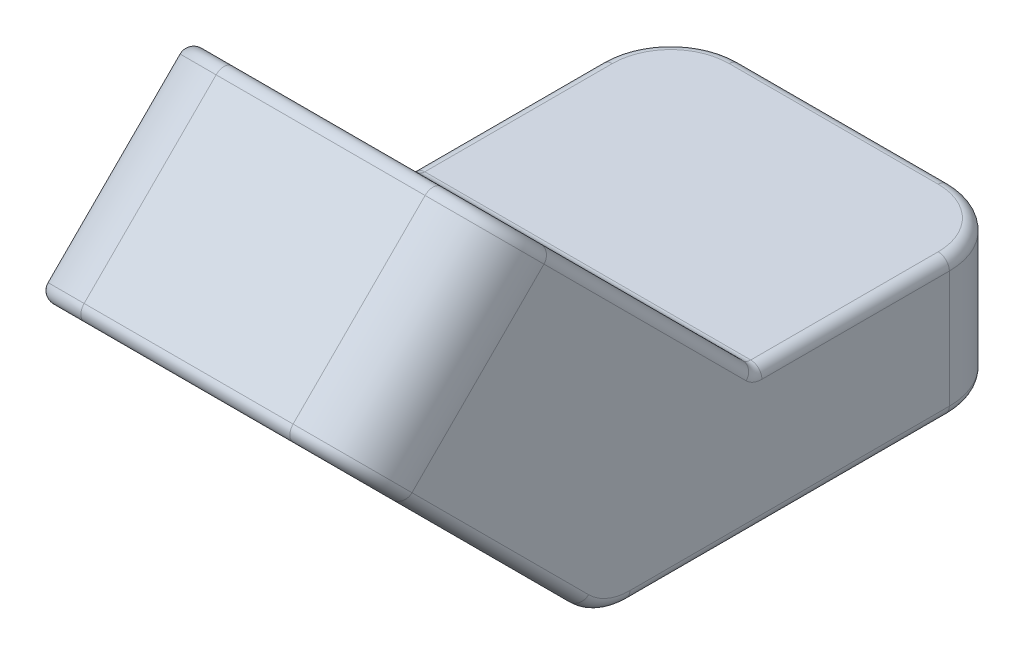
ISO-10303-21;
HEADER;
FILE_DESCRIPTION(('STEP AP214'),'2;1');
FILE_NAME('part.step','',(''),(''),'','','');
FILE_SCHEMA(('AUTOMOTIVE_DESIGN { 1 0 10303 214 1 1 1 1 }'));
ENDSEC;
DATA;
#1=APPLICATION_CONTEXT('core data for automotive mechanical design processes');
#2=APPLICATION_PROTOCOL_DEFINITION('international standard','automotive_design',2000,#1);
#3=PRODUCT_CONTEXT('',#1,'mechanical');
#4=PRODUCT('Part','Part','',(#3));
#5=PRODUCT_RELATED_PRODUCT_CATEGORY('part','',(#4));
#6=PRODUCT_DEFINITION_FORMATION('','',#4);
#7=PRODUCT_DEFINITION_CONTEXT('part definition',#1,'design');
#8=PRODUCT_DEFINITION('design','',#6,#7);
#9=PRODUCT_DEFINITION_SHAPE('','',#8);
#10=(LENGTH_UNIT() NAMED_UNIT(*) SI_UNIT(.MILLI.,.METRE.));
#11=(NAMED_UNIT(*) PLANE_ANGLE_UNIT() SI_UNIT($,.RADIAN.));
#12=(NAMED_UNIT(*) SI_UNIT($,.STERADIAN.) SOLID_ANGLE_UNIT());
#13=UNCERTAINTY_MEASURE_WITH_UNIT(LENGTH_MEASURE(1.E-05),#10,'distance_accuracy_value','');
#14=(GEOMETRIC_REPRESENTATION_CONTEXT(3) GLOBAL_UNCERTAINTY_ASSIGNED_CONTEXT((#13)) GLOBAL_UNIT_ASSIGNED_CONTEXT((#10,
#11,#12)) REPRESENTATION_CONTEXT('',''));
#15=CARTESIAN_POINT('',(0.,0.,0.));
#16=DIRECTION('',(0.,0.,1.));
#17=DIRECTION('',(1.,0.,0.));
#18=AXIS2_PLACEMENT_3D('',#15,#16,#17);
#19=CARTESIAN_POINT('',(15.875,6.35,0.));
#20=DIRECTION('',(0.,0.,1.));
#21=DIRECTION('',(0.,-1.,0.));
#22=AXIS2_PLACEMENT_3D('',#19,#20,#21);
#23=PLANE('',#22);
#24=DIRECTION('',(0.,1.,0.));
#25=VECTOR('',#24,1.);
#26=CARTESIAN_POINT('',(12.7,6.35,0.));
#27=LINE('',#26,#25);
#28=CARTESIAN_POINT('',(12.7,5.842,0.));
#29=VERTEX_POINT('',#28);
#30=CARTESIAN_POINT('',(12.7,0.508,0.));
#31=VERTEX_POINT('',#30);
#32=EDGE_CURVE('E517',#29,#31,#27,.F.);
#33=ORIENTED_EDGE('',*,*,#32,.T.);
#34=DIRECTION('',(-1.,0.,0.));
#35=VECTOR('',#34,1.);
#36=CARTESIAN_POINT('',(15.875,0.508,0.));
#37=LINE('',#36,#35);
#38=CARTESIAN_POINT('',(3.175,0.508,0.));
#39=VERTEX_POINT('',#38);
#40=EDGE_CURVE('E388',#31,#39,#37,.T.);
#41=ORIENTED_EDGE('',*,*,#40,.T.);
#42=DIRECTION('',(0.,1.,0.));
#43=VECTOR('',#42,1.);
#44=CARTESIAN_POINT('',(3.175,6.35,0.));
#45=LINE('',#44,#43);
#46=CARTESIAN_POINT('',(3.175,5.842,0.));
#47=VERTEX_POINT('',#46);
#48=EDGE_CURVE('E513',#39,#47,#45,.T.);
#49=ORIENTED_EDGE('',*,*,#48,.T.);
#50=DIRECTION('',(-1.,0.,0.));
#51=VECTOR('',#50,1.);
#52=CARTESIAN_POINT('',(15.875,5.842,0.));
#53=LINE('',#52,#51);
#54=EDGE_CURVE('E391',#47,#29,#53,.F.);
#55=ORIENTED_EDGE('',*,*,#54,.T.);
#56=EDGE_LOOP('',(#33,#41,#49,#55));
#57=FACE_BOUND('',#56,.T.);
#58=ADVANCED_FACE('F47',(#57),#23,.F.);
#59=CARTESIAN_POINT('',(15.875,6.35,11.9296158183963));
#60=DIRECTION('',(0.,-1.,0.));
#61=DIRECTION('',(0.,0.,-1.));
#62=AXIS2_PLACEMENT_3D('',#59,#60,#61);
#63=PLANE('',#62);
#64=CARTESIAN_POINT('',(3.175,6.35,3.175));
#65=DIRECTION('',(0.,-1.,0.));
#66=DIRECTION('',(0.,0.,-1.));
#67=AXIS2_PLACEMENT_3D('',#64,#65,#66);
#68=CIRCLE('',#67,2.667);
#69=CARTESIAN_POINT('',(3.175,6.35,0.507999999999998));
#70=VERTEX_POINT('',#69);
#71=CARTESIAN_POINT('',(0.508000000000001,6.35,3.175));
#72=VERTEX_POINT('',#71);
#73=EDGE_CURVE('E372',#70,#72,#68,.F.);
#74=ORIENTED_EDGE('',*,*,#73,.T.);
#75=DIRECTION('',(0.,0.,1.));
#76=VECTOR('',#75,1.);
#77=CARTESIAN_POINT('',(0.508,6.35,11.9296158183963));
#78=LINE('',#77,#76);
#79=CARTESIAN_POINT('',(0.508,6.35,11.7191953287107));
#80=VERTEX_POINT('',#79);
#81=EDGE_CURVE('E368',#72,#80,#78,.T.);
#82=ORIENTED_EDGE('',*,*,#81,.T.);
#83=DIRECTION('',(-1.,0.,0.));
#84=VECTOR('',#83,1.);
#85=CARTESIAN_POINT('',(15.875,6.35,11.7191953287107));
#86=LINE('',#85,#84);
#87=CARTESIAN_POINT('',(15.367,6.35,11.7191953287107));
#88=VERTEX_POINT('',#87);
#89=EDGE_CURVE('E381',#80,#88,#86,.F.);
#90=ORIENTED_EDGE('',*,*,#89,.T.);
#91=DIRECTION('',(0.,0.,1.));
#92=VECTOR('',#91,1.);
#93=CARTESIAN_POINT('',(15.367,6.35,11.9296158183963));
#94=LINE('',#93,#92);
#95=CARTESIAN_POINT('',(15.367,6.35,3.175));
#96=VERTEX_POINT('',#95);
#97=EDGE_CURVE('E248',#88,#96,#94,.F.);
#98=ORIENTED_EDGE('',*,*,#97,.T.);
#99=CARTESIAN_POINT('',(12.7,6.35,3.175));
#100=DIRECTION('',(0.,-1.,0.));
#101=DIRECTION('',(0.,0.,-1.));
#102=AXIS2_PLACEMENT_3D('',#99,#100,#101);
#103=CIRCLE('',#102,2.667);
#104=CARTESIAN_POINT('',(12.7,6.35,0.507999999999998));
#105=VERTEX_POINT('',#104);
#106=EDGE_CURVE('E378',#96,#105,#103,.F.);
#107=ORIENTED_EDGE('',*,*,#106,.T.);
#108=DIRECTION('',(-1.,0.,0.));
#109=VECTOR('',#108,1.);
#110=CARTESIAN_POINT('',(15.875,6.35,0.507999999999998));
#111=LINE('',#110,#109);
#112=EDGE_CURVE('E375',#105,#70,#111,.T.);
#113=ORIENTED_EDGE('',*,*,#112,.T.);
#114=EDGE_LOOP('',(#74,#82,#90,#98,#107,#113));
#115=FACE_BOUND('',#114,.T.);
#116=ADVANCED_FACE('F552',(#115),#63,.F.);
#117=CARTESIAN_POINT('',(15.875,17.9605122421383,23.5401280605345));
#118=DIRECTION('',(0.,-0.707106781186546,0.707106781186549));
#119=DIRECTION('',(0.,-0.707106781186549,-0.707106781186546));
#120=AXIS2_PLACEMENT_3D('',#117,#118,#119);
#121=PLANE('',#120);
#122=DIRECTION('',(-1.,0.,0.));
#123=VECTOR('',#122,1.);
#124=CARTESIAN_POINT('',(0.,6.49878975515723,12.0784055735535));
#125=LINE('',#124,#123);
#126=CARTESIAN_POINT('',(15.367,6.49878975515723,12.0784055735535));
#127=VERTEX_POINT('',#126);
#128=CARTESIAN_POINT('',(0.508,6.49878975515723,12.0784055735535));
#129=VERTEX_POINT('',#128);
#130=EDGE_CURVE('E362',#127,#129,#125,.T.);
#131=ORIENTED_EDGE('',*,*,#130,.T.);
#132=DIRECTION('',(0.,0.707106781186549,0.707106781186546));
#133=VECTOR('',#132,1.);
#134=CARTESIAN_POINT('',(0.508,15.715448211871,21.2950640302673));
#135=LINE('',#134,#133);
#136=CARTESIAN_POINT('',(0.508000000000001,15.715448211871,21.2950640302673));
#137=VERTEX_POINT('',#136);
#138=EDGE_CURVE('E11',#129,#137,#135,.T.);
#139=ORIENTED_EDGE('',*,*,#138,.T.);
#140=CARTESIAN_POINT('',(3.175,15.715448211871,21.2950640302673));
#141=DIRECTION('',(0.,-0.707106781186546,0.707106781186549));
#142=DIRECTION('',(0.,-0.707106781186549,-0.707106781186546));
#143=AXIS2_PLACEMENT_3D('',#140,#141,#142);
#144=CIRCLE('',#143,2.667);
#145=CARTESIAN_POINT('',(3.175,17.6013019972955,23.1809178156918));
#146=VERTEX_POINT('',#145);
#147=EDGE_CURVE('E57',#137,#146,#144,.F.);
#148=ORIENTED_EDGE('',*,*,#147,.T.);
#149=DIRECTION('',(-1.,0.,0.));
#150=VECTOR('',#149,1.);
#151=CARTESIAN_POINT('',(15.875,17.6013019972955,23.1809178156918));
#152=LINE('',#151,#150);
#153=CARTESIAN_POINT('',(12.7,17.6013019972955,23.1809178156918));
#154=VERTEX_POINT('',#153);
#155=EDGE_CURVE('E356',#146,#154,#152,.F.);
#156=ORIENTED_EDGE('',*,*,#155,.T.);
#157=CARTESIAN_POINT('',(12.7,15.715448211871,21.2950640302673));
#158=DIRECTION('',(0.,-0.707106781186546,0.707106781186549));
#159=DIRECTION('',(0.,-0.707106781186549,-0.707106781186546));
#160=AXIS2_PLACEMENT_3D('',#157,#158,#159);
#161=CIRCLE('',#160,2.667);
#162=CARTESIAN_POINT('',(15.367,15.715448211871,21.2950640302673));
#163=VERTEX_POINT('',#162);
#164=EDGE_CURVE('E359',#154,#163,#161,.F.);
#165=ORIENTED_EDGE('',*,*,#164,.T.);
#166=DIRECTION('',(0.,0.707106781186549,0.707106781186546));
#167=VECTOR('',#166,1.);
#168=CARTESIAN_POINT('',(15.367,17.9605122421383,23.5401280605345));
#169=LINE('',#168,#167);
#170=EDGE_CURVE('E365',#163,#127,#169,.F.);
#171=ORIENTED_EDGE('',*,*,#170,.T.);
#172=EDGE_LOOP('',(#131,#139,#148,#156,#165,#171));
#173=FACE_BOUND('',#172,.T.);
#174=CARTESIAN_POINT('',(7.9375,11.5585485502201,17.1381643686164));
#175=DIRECTION('',(0.,-0.707106781186546,0.707106781186549));
#176=DIRECTION('',(0.,-0.707106781186549,-0.707106781186546));
#177=AXIS2_PLACEMENT_3D('',#174,#175,#176);
#178=CIRCLE('',#177,6.47699999999998);
#179=CARTESIAN_POINT('',(7.9375,6.97861792847485,12.5582337468711));
#180=VERTEX_POINT('',#179);
#181=EDGE_CURVE('E520',#180,#180,#178,.T.);
#182=ORIENTED_EDGE('',*,*,#181,.T.);
#183=EDGE_LOOP('',(#182));
#184=FACE_BOUND('',#183,.T.);
#185=ADVANCED_FACE('F558',(#173,#184),#121,.F.);
#186=CARTESIAN_POINT('',(15.875,11.2253201513365,30.2753201513364));
#187=DIRECTION('',(0.,-0.707106781186549,-0.707106781186546));
#188=DIRECTION('',(0.,0.707106781186546,-0.707106781186549));
#189=AXIS2_PLACEMENT_3D('',#186,#187,#188);
#190=PLANE('',#189);
#191=DIRECTION('',(0.,-0.707106781186546,0.707106781186549));
#192=VECTOR('',#191,1.);
#193=CARTESIAN_POINT('',(3.175,11.2253201513365,30.2753201513364));
#194=LINE('',#193,#192);
#195=CARTESIAN_POINT('',(3.175,17.6013019972955,23.8993383053773));
#196=VERTEX_POINT('',#195);
#197=CARTESIAN_POINT('',(3.175,11.5845303961792,29.9161099064937));
#198=VERTEX_POINT('',#197);
#199=EDGE_CURVE('E492',#196,#198,#194,.T.);
#200=ORIENTED_EDGE('',*,*,#199,.T.);
#201=DIRECTION('',(-1.,0.,0.));
#202=VECTOR('',#201,1.);
#203=CARTESIAN_POINT('',(15.875,11.5845303961792,29.9161099064937));
#204=LINE('',#203,#202);
#205=CARTESIAN_POINT('',(12.7,11.5845303961792,29.9161099064937));
#206=VERTEX_POINT('',#205);
#207=EDGE_CURVE('E440',#198,#206,#204,.F.);
#208=ORIENTED_EDGE('',*,*,#207,.T.);
#209=DIRECTION('',(0.,-0.707106781186546,0.707106781186549));
#210=VECTOR('',#209,1.);
#211=CARTESIAN_POINT('',(12.7,11.2253201513365,30.2753201513364));
#212=LINE('',#211,#210);
#213=CARTESIAN_POINT('',(12.7,17.6013019972955,23.8993383053773));
#214=VERTEX_POINT('',#213);
#215=EDGE_CURVE('E235',#206,#214,#212,.F.);
#216=ORIENTED_EDGE('',*,*,#215,.T.);
#217=DIRECTION('',(-1.,0.,0.));
#218=VECTOR('',#217,1.);
#219=CARTESIAN_POINT('',(15.875,17.6013019972955,23.8993383053773));
#220=LINE('',#219,#218);
#221=EDGE_CURVE('E443',#214,#196,#220,.T.);
#222=ORIENTED_EDGE('',*,*,#221,.T.);
#223=EDGE_LOOP('',(#200,#208,#216,#222));
#224=FACE_BOUND('',#223,.T.);
#225=ADVANCED_FACE('F724',(#224),#190,.F.);
#226=CARTESIAN_POINT('',(15.875,0.,19.05));
#227=DIRECTION('',(0.,0.707106781186546,-0.707106781186549));
#228=DIRECTION('',(0.,0.707106781186549,0.707106781186546));
#229=AXIS2_PLACEMENT_3D('',#226,#227,#228);
#230=PLANE('',#229);
#231=CARTESIAN_POINT('',(7.9375,4.82335645941826,23.8733564594183));
#232=DIRECTION('',(0.,0.707106781186546,-0.707106781186549));
#233=DIRECTION('',(0.,0.707106781186549,0.707106781186546));
#234=AXIS2_PLACEMENT_3D('',#231,#232,#233);
#235=CIRCLE('',#234,3.302);
#236=CARTESIAN_POINT('',(7.9375,7.15822305089625,26.2082230508962));
#237=VERTEX_POINT('',#236);
#238=EDGE_CURVE('E294',#237,#237,#235,.T.);
#239=ORIENTED_EDGE('',*,*,#238,.T.);
#240=EDGE_LOOP('',(#239));
#241=FACE_BOUND('',#240,.T.);
#242=DIRECTION('',(-1.,0.,0.));
#243=VECTOR('',#242,1.);
#244=CARTESIAN_POINT('',(15.875,0.929935969732714,19.9799359697327));
#245=LINE('',#244,#243);
#246=CARTESIAN_POINT('',(0.508,0.929935969732714,19.9799359697327));
#247=VERTEX_POINT('',#246);
#248=CARTESIAN_POINT('',(15.367,0.929935969732714,19.9799359697327));
#249=VERTEX_POINT('',#248);
#250=EDGE_CURVE('E488',#247,#249,#245,.F.);
#251=ORIENTED_EDGE('',*,*,#250,.T.);
#252=DIRECTION('',(0.,-0.707106781186549,-0.707106781186546));
#253=VECTOR('',#252,1.);
#254=CARTESIAN_POINT('',(15.367,0.,19.05));
#255=LINE('',#254,#253);
#256=CARTESIAN_POINT('',(15.367,8.98025612106917,28.0302561210691));
#257=VERTEX_POINT('',#256);
#258=EDGE_CURVE('E452',#249,#257,#255,.F.);
#259=ORIENTED_EDGE('',*,*,#258,.T.);
#260=CARTESIAN_POINT('',(12.7,8.98025612106917,28.0302561210691));
#261=DIRECTION('',(0.,0.707106781186546,-0.707106781186549));
#262=DIRECTION('',(0.,0.707106781186549,0.707106781186546));
#263=AXIS2_PLACEMENT_3D('',#260,#261,#262);
#264=CIRCLE('',#263,2.667);
#265=CARTESIAN_POINT('',(12.7,10.8661099064937,29.9161099064937));
#266=VERTEX_POINT('',#265);
#267=EDGE_CURVE('E455',#257,#266,#264,.F.);
#268=ORIENTED_EDGE('',*,*,#267,.T.);
#269=DIRECTION('',(-1.,0.,0.));
#270=VECTOR('',#269,1.);
#271=CARTESIAN_POINT('',(15.875,10.8661099064937,29.9161099064937));
#272=LINE('',#271,#270);
#273=CARTESIAN_POINT('',(3.175,10.8661099064937,29.9161099064937));
#274=VERTEX_POINT('',#273);
#275=EDGE_CURVE('E458',#266,#274,#272,.T.);
#276=ORIENTED_EDGE('',*,*,#275,.T.);
#277=CARTESIAN_POINT('',(3.175,8.98025612106917,28.0302561210691));
#278=DIRECTION('',(0.,0.707106781186546,-0.707106781186549));
#279=DIRECTION('',(0.,0.707106781186549,0.707106781186546));
#280=AXIS2_PLACEMENT_3D('',#277,#278,#279);
#281=CIRCLE('',#280,2.667);
#282=CARTESIAN_POINT('',(0.508,8.98025612106917,28.0302561210691));
#283=VERTEX_POINT('',#282);
#284=EDGE_CURVE('E461',#274,#283,#281,.F.);
#285=ORIENTED_EDGE('',*,*,#284,.T.);
#286=DIRECTION('',(0.,-0.707106781186549,-0.707106781186546));
#287=VECTOR('',#286,1.);
#288=CARTESIAN_POINT('',(0.508,0.929935969732715,19.9799359697327));
#289=LINE('',#288,#287);
#290=EDGE_CURVE('E464',#283,#247,#289,.T.);
#291=ORIENTED_EDGE('',*,*,#290,.T.);
#292=EDGE_LOOP('',(#251,#259,#268,#276,#285,#291));
#293=FACE_BOUND('',#292,.T.);
#294=ADVANCED_FACE('F532',(#241,#293),#230,.F.);
#295=CARTESIAN_POINT('',(15.875,0.,0.));
#296=DIRECTION('',(0.,1.,0.));
#297=DIRECTION('',(0.,0.,1.));
#298=AXIS2_PLACEMENT_3D('',#295,#296,#297);
#299=PLANE('',#298);
#300=DIRECTION('',(-1.,0.,0.));
#301=VECTOR('',#300,1.);
#302=CARTESIAN_POINT('',(15.875,0.,17.7348719394654));
#303=LINE('',#302,#301);
#304=CARTESIAN_POINT('',(15.367,0.,17.7348719394654));
#305=VERTEX_POINT('',#304);
#306=CARTESIAN_POINT('',(0.508,0.,17.7348719394654));
#307=VERTEX_POINT('',#306);
#308=EDGE_CURVE('E501',#305,#307,#303,.T.);
#309=ORIENTED_EDGE('',*,*,#308,.T.);
#310=DIRECTION('',(0.,0.,-1.));
#311=VECTOR('',#310,1.);
#312=CARTESIAN_POINT('',(0.508,0.,3.175));
#313=LINE('',#312,#311);
#314=CARTESIAN_POINT('',(0.508000000000001,0.,3.175));
#315=VERTEX_POINT('',#314);
#316=EDGE_CURVE('E400',#307,#315,#313,.T.);
#317=ORIENTED_EDGE('',*,*,#316,.T.);
#318=CARTESIAN_POINT('',(3.175,0.,3.175));
#319=DIRECTION('',(0.,1.,0.));
#320=DIRECTION('',(0.,0.,1.));
#321=AXIS2_PLACEMENT_3D('',#318,#319,#320);
#322=CIRCLE('',#321,2.667);
#323=CARTESIAN_POINT('',(3.175,0.,0.508));
#324=VERTEX_POINT('',#323);
#325=EDGE_CURVE('E403',#315,#324,#322,.F.);
#326=ORIENTED_EDGE('',*,*,#325,.T.);
#327=DIRECTION('',(-1.,0.,0.));
#328=VECTOR('',#327,1.);
#329=CARTESIAN_POINT('',(15.875,0.,0.508));
#330=LINE('',#329,#328);
#331=CARTESIAN_POINT('',(12.7,0.,0.508));
#332=VERTEX_POINT('',#331);
#333=EDGE_CURVE('E406',#324,#332,#330,.F.);
#334=ORIENTED_EDGE('',*,*,#333,.T.);
#335=CARTESIAN_POINT('',(12.7,0.,3.175));
#336=DIRECTION('',(0.,1.,0.));
#337=DIRECTION('',(0.,0.,1.));
#338=AXIS2_PLACEMENT_3D('',#335,#336,#337);
#339=CIRCLE('',#338,2.667);
#340=CARTESIAN_POINT('',(15.367,0.,3.175));
#341=VERTEX_POINT('',#340);
#342=EDGE_CURVE('E409',#332,#341,#339,.F.);
#343=ORIENTED_EDGE('',*,*,#342,.T.);
#344=DIRECTION('',(0.,0.,-1.));
#345=VECTOR('',#344,1.);
#346=CARTESIAN_POINT('',(15.367,0.,0.));
#347=LINE('',#346,#345);
#348=EDGE_CURVE('E251',#341,#305,#347,.F.);
#349=ORIENTED_EDGE('',*,*,#348,.T.);
#350=EDGE_LOOP('',(#309,#317,#326,#334,#343,#349));
#351=FACE_BOUND('',#350,.T.);
#352=ADVANCED_FACE('F736',(#351),#299,.F.);
#353=CARTESIAN_POINT('',(15.875,0.,0.));
#354=DIRECTION('',(-1.,0.,0.));
#355=DIRECTION('',(0.,0.,1.));
#356=AXIS2_PLACEMENT_3D('',#353,#354,#355);
#357=PLANE('',#356);
#358=DIRECTION('',(0.,-0.707106781186546,0.707106781186549));
#359=VECTOR('',#358,1.);
#360=CARTESIAN_POINT('',(15.875,18.5052561210692,18.5052561210691));
#361=LINE('',#360,#359);
#362=CARTESIAN_POINT('',(15.875,15.3562379670283,21.65427427511));
#363=VERTEX_POINT('',#362);
#364=CARTESIAN_POINT('',(15.875,9.33946636591193,27.6710458762264));
#365=VERTEX_POINT('',#364);
#366=EDGE_CURVE('E236',#363,#365,#361,.T.);
#367=ORIENTED_EDGE('',*,*,#366,.T.);
#368=DIRECTION('',(0.,-0.707106781186549,-0.707106781186546));
#369=VECTOR('',#368,1.);
#370=CARTESIAN_POINT('',(15.875,-9.16578975515724,9.16578975515727));
#371=LINE('',#370,#369);
#372=CARTESIAN_POINT('',(15.875,1.28914621457548,19.6207257248899));
#373=VERTEX_POINT('',#372);
#374=EDGE_CURVE('E474',#365,#373,#371,.T.);
#375=ORIENTED_EDGE('',*,*,#374,.T.);
#376=CARTESIAN_POINT('',(15.875,3.175,17.7348719394654));
#377=DIRECTION('',(-1.,0.,0.));
#378=DIRECTION('',(0.,0.,1.));
#379=AXIS2_PLACEMENT_3D('',#376,#377,#378);
#380=CIRCLE('',#379,2.667);
#381=CARTESIAN_POINT('',(15.875,0.507999999999998,17.7348719394654));
#382=VERTEX_POINT('',#381);
#383=EDGE_CURVE('E219',#373,#382,#380,.F.);
#384=ORIENTED_EDGE('',*,*,#383,.T.);
#385=DIRECTION('',(0.,0.,-1.));
#386=VECTOR('',#385,1.);
#387=CARTESIAN_POINT('',(15.875,0.508,0.));
#388=LINE('',#387,#386);
#389=CARTESIAN_POINT('',(15.875,0.508,3.175));
#390=VERTEX_POINT('',#389);
#391=EDGE_CURVE('E212',#382,#390,#388,.T.);
#392=ORIENTED_EDGE('',*,*,#391,.T.);
#393=DIRECTION('',(0.,1.,0.));
#394=VECTOR('',#393,1.);
#395=CARTESIAN_POINT('',(15.875,0.,3.175));
#396=LINE('',#395,#394);
#397=CARTESIAN_POINT('',(15.875,5.842,3.175));
#398=VERTEX_POINT('',#397);
#399=EDGE_CURVE('E216',#390,#398,#396,.T.);
#400=ORIENTED_EDGE('',*,*,#399,.T.);
#401=DIRECTION('',(0.,0.,1.));
#402=VECTOR('',#401,1.);
#403=CARTESIAN_POINT('',(15.875,5.842,0.));
#404=LINE('',#403,#402);
#405=CARTESIAN_POINT('',(15.875,5.842,11.7191953287107));
#406=VERTEX_POINT('',#405);
#407=EDGE_CURVE('E224',#398,#406,#404,.T.);
#408=ORIENTED_EDGE('',*,*,#407,.T.);
#409=CARTESIAN_POINT('',(15.875,6.858,11.7191953287107));
#410=DIRECTION('',(-1.,0.,0.));
#411=DIRECTION('',(0.,0.,1.));
#412=AXIS2_PLACEMENT_3D('',#409,#410,#411);
#413=CIRCLE('',#412,1.016);
#414=CARTESIAN_POINT('',(15.875,6.13957951031447,12.4376158183963));
#415=VERTEX_POINT('',#414);
#416=EDGE_CURVE('E481',#415,#406,#413,.F.);
#417=ORIENTED_EDGE('',*,*,#416,.F.);
#418=DIRECTION('',(0.,0.707106781186549,0.707106781186546));
#419=VECTOR('',#418,1.);
#420=CARTESIAN_POINT('',(15.875,-3.14901815404091,3.14901815404092));
#421=LINE('',#420,#419);
#422=EDGE_CURVE('E485',#415,#363,#421,.T.);
#423=ORIENTED_EDGE('',*,*,#422,.T.);
#424=EDGE_LOOP('',(#367,#375,#384,#392,#400,#408,#417,#423));
#425=FACE_BOUND('',#424,.T.);
#426=ADVANCED_FACE('F215',(#425),#357,.F.);
#427=CARTESIAN_POINT('',(0.,0.,0.));
#428=DIRECTION('',(-1.,0.,0.));
#429=DIRECTION('',(0.,0.,1.));
#430=AXIS2_PLACEMENT_3D('',#427,#428,#429);
#431=PLANE('',#430);
#432=CARTESIAN_POINT('',(0.,3.175,17.7348719394654));
#433=DIRECTION('',(-1.,0.,0.));
#434=DIRECTION('',(0.,0.,1.));
#435=AXIS2_PLACEMENT_3D('',#432,#433,#434);
#436=CIRCLE('',#435,2.667);
#437=CARTESIAN_POINT('',(0.,0.507999999999998,17.7348719394654));
#438=VERTEX_POINT('',#437);
#439=CARTESIAN_POINT('',(0.,1.28914621457548,19.6207257248899));
#440=VERTEX_POINT('',#439);
#441=EDGE_CURVE('E417',#438,#440,#436,.T.);
#442=ORIENTED_EDGE('',*,*,#441,.T.);
#443=DIRECTION('',(0.,-0.707106781186549,-0.707106781186546));
#444=VECTOR('',#443,1.);
#445=CARTESIAN_POINT('',(0.,9.33946636591193,27.6710458762264));
#446=LINE('',#445,#444);
#447=CARTESIAN_POINT('',(0.,9.33946636591193,27.6710458762264));
#448=VERTEX_POINT('',#447);
#449=EDGE_CURVE('E414',#440,#448,#446,.F.);
#450=ORIENTED_EDGE('',*,*,#449,.T.);
#451=DIRECTION('',(0.,-0.707106781186546,0.707106781186549));
#452=VECTOR('',#451,1.);
#453=CARTESIAN_POINT('',(0.,15.715448211871,21.2950640302673));
#454=LINE('',#453,#452);
#455=CARTESIAN_POINT('',(0.,15.3562379670283,21.65427427511));
#456=VERTEX_POINT('',#455);
#457=EDGE_CURVE('E509',#448,#456,#454,.F.);
#458=ORIENTED_EDGE('',*,*,#457,.T.);
#459=DIRECTION('',(0.,0.707106781186549,0.707106781186546));
#460=VECTOR('',#459,1.);
#461=CARTESIAN_POINT('',(0.,5.99078975515723,12.288826063239));
#462=LINE('',#461,#460);
#463=CARTESIAN_POINT('',(0.,6.13957951031447,12.4376158183963));
#464=VERTEX_POINT('',#463);
#465=EDGE_CURVE('E427',#456,#464,#462,.F.);
#466=ORIENTED_EDGE('',*,*,#465,.T.);
#467=CARTESIAN_POINT('',(0.,6.858,11.7191953287107));
#468=DIRECTION('',(-1.,0.,0.));
#469=DIRECTION('',(0.,0.,1.));
#470=AXIS2_PLACEMENT_3D('',#467,#468,#469);
#471=CIRCLE('',#470,1.016);
#472=CARTESIAN_POINT('',(0.,5.842,11.7191953287107));
#473=VERTEX_POINT('',#472);
#474=EDGE_CURVE('E430',#473,#464,#471,.T.);
#475=ORIENTED_EDGE('',*,*,#474,.F.);
#476=DIRECTION('',(0.,0.,1.));
#477=VECTOR('',#476,1.);
#478=CARTESIAN_POINT('',(0.,5.842,3.175));
#479=LINE('',#478,#477);
#480=CARTESIAN_POINT('',(0.,5.842,3.175));
#481=VERTEX_POINT('',#480);
#482=EDGE_CURVE('E423',#473,#481,#479,.F.);
#483=ORIENTED_EDGE('',*,*,#482,.T.);
#484=DIRECTION('',(0.,1.,0.));
#485=VECTOR('',#484,1.);
#486=CARTESIAN_POINT('',(0.,0.,3.175));
#487=LINE('',#486,#485);
#488=CARTESIAN_POINT('',(0.,0.508,3.175));
#489=VERTEX_POINT('',#488);
#490=EDGE_CURVE('E505',#481,#489,#487,.F.);
#491=ORIENTED_EDGE('',*,*,#490,.T.);
#492=DIRECTION('',(0.,0.,-1.));
#493=VECTOR('',#492,1.);
#494=CARTESIAN_POINT('',(0.,0.507999999999998,17.7348719394654));
#495=LINE('',#494,#493);
#496=EDGE_CURVE('E420',#489,#438,#495,.F.);
#497=ORIENTED_EDGE('',*,*,#496,.T.);
#498=EDGE_LOOP('',(#442,#450,#458,#466,#475,#483,#491,#497));
#499=FACE_BOUND('',#498,.T.);
#500=ADVANCED_FACE('F538',(#499),#431,.T.);
#501=CARTESIAN_POINT('',(7.9375,-0.789303616249948,29.4860165350865));
#502=DIRECTION('',(0.,0.707106781186547,-0.707106781186549));
#503=DIRECTION('',(0.,0.707106781186549,0.707106781186546));
#504=AXIS2_PLACEMENT_3D('',#501,#502,#503);
#505=CYLINDRICAL_SURFACE('',#504,3.302);
#506=CARTESIAN_POINT('',(7.9375,8.97589781761239,19.7208151012241));
#507=DIRECTION('',(0.,-0.707106781186546,0.707106781186549));
#508=DIRECTION('',(0.,-0.707106781186549,-0.707106781186546));
#509=AXIS2_PLACEMENT_3D('',#506,#507,#508);
#510=CIRCLE('',#509,3.302);
#511=CARTESIAN_POINT('',(7.9375,6.6410312261344,17.3859485097461));
#512=VERTEX_POINT('',#511);
#513=EDGE_CURVE('E524',#512,#512,#510,.F.);
#514=ORIENTED_EDGE('',*,*,#513,.T.);
#515=EDGE_LOOP('',(#514));
#516=FACE_BOUND('',#515,.T.);
#517=ORIENTED_EDGE('',*,*,#238,.F.);
#518=EDGE_LOOP('',(#517));
#519=FACE_BOUND('',#518,.T.);
#520=ADVANCED_FACE('F535',(#516,#519),#505,.F.);
#521=CARTESIAN_POINT('',(7.9375,8.97589781761239,19.7208151012241));
#522=DIRECTION('',(0.,0.707106781186546,-0.707106781186549));
#523=DIRECTION('',(0.,0.707106781186549,0.707106781186546));
#524=AXIS2_PLACEMENT_3D('',#521,#522,#523);
#525=CONICAL_SURFACE('',#524,3.302,0.715584993317676);
#526=ORIENTED_EDGE('',*,*,#181,.F.);
#527=EDGE_LOOP('',(#526));
#528=FACE_BOUND('',#527,.T.);
#529=ORIENTED_EDGE('',*,*,#513,.F.);
#530=EDGE_LOOP('',(#529));
#531=FACE_BOUND('',#530,.T.);
#532=ADVANCED_FACE('F537',(#528,#531),#525,.F.);
#533=CARTESIAN_POINT('',(3.175,6.35,3.175));
#534=DIRECTION('',(0.,-1.,0.));
#535=DIRECTION('',(0.,0.,-1.));
#536=AXIS2_PLACEMENT_3D('',#533,#534,#535);
#537=CYLINDRICAL_SURFACE('',#536,3.175);
#538=ORIENTED_EDGE('',*,*,#48,.F.);
#539=CARTESIAN_POINT('',(3.175,0.508,3.175));
#540=DIRECTION('',(0.,1.,0.));
#541=DIRECTION('',(0.,0.,1.));
#542=AXIS2_PLACEMENT_3D('',#539,#540,#541);
#543=CIRCLE('',#542,3.175);
#544=EDGE_CURVE('E394',#39,#489,#543,.T.);
#545=ORIENTED_EDGE('',*,*,#544,.T.);
#546=ORIENTED_EDGE('',*,*,#490,.F.);
#547=CARTESIAN_POINT('',(3.175,5.842,3.175));
#548=DIRECTION('',(0.,-1.,0.));
#549=DIRECTION('',(0.,0.,-1.));
#550=AXIS2_PLACEMENT_3D('',#547,#548,#549);
#551=CIRCLE('',#550,3.175);
#552=EDGE_CURVE('E397',#481,#47,#551,.T.);
#553=ORIENTED_EDGE('',*,*,#552,.T.);
#554=EDGE_LOOP('',(#538,#545,#546,#553));
#555=FACE_BOUND('',#554,.T.);
#556=ADVANCED_FACE('F545',(#555),#537,.T.);
#557=CARTESIAN_POINT('',(12.7,0.,3.175));
#558=DIRECTION('',(0.,1.,0.));
#559=DIRECTION('',(0.,0.,1.));
#560=AXIS2_PLACEMENT_3D('',#557,#558,#559);
#561=CYLINDRICAL_SURFACE('',#560,3.175);
#562=ORIENTED_EDGE('',*,*,#399,.F.);
#563=CARTESIAN_POINT('',(12.7,0.507999999999999,3.175));
#564=DIRECTION('',(0.,1.,0.));
#565=DIRECTION('',(0.,0.,1.));
#566=AXIS2_PLACEMENT_3D('',#563,#564,#565);
#567=CIRCLE('',#566,3.175);
#568=EDGE_CURVE('E230',#390,#31,#567,.T.);
#569=ORIENTED_EDGE('',*,*,#568,.T.);
#570=ORIENTED_EDGE('',*,*,#32,.F.);
#571=CARTESIAN_POINT('',(12.7,5.842,3.175));
#572=DIRECTION('',(0.,-1.,0.));
#573=DIRECTION('',(0.,0.,-1.));
#574=AXIS2_PLACEMENT_3D('',#571,#572,#573);
#575=CIRCLE('',#574,3.175);
#576=EDGE_CURVE('E233',#29,#398,#575,.T.);
#577=ORIENTED_EDGE('',*,*,#576,.T.);
#578=EDGE_LOOP('',(#562,#569,#570,#577));
#579=FACE_BOUND('',#578,.T.);
#580=ADVANCED_FACE('F228',(#579),#561,.T.);
#581=CARTESIAN_POINT('',(3.175,8.98025612106916,28.0302561210691));
#582=DIRECTION('',(0.,0.707106781186546,-0.707106781186549));
#583=DIRECTION('',(0.,0.707106781186549,0.707106781186546));
#584=AXIS2_PLACEMENT_3D('',#581,#582,#583);
#585=CYLINDRICAL_SURFACE('',#584,3.175);
#586=ORIENTED_EDGE('',*,*,#457,.F.);
#587=CARTESIAN_POINT('',(3.175,9.33946636591193,27.6710458762264));
#588=DIRECTION('',(0.,0.707106781186546,-0.707106781186549));
#589=DIRECTION('',(0.,0.707106781186549,0.707106781186546));
#590=AXIS2_PLACEMENT_3D('',#587,#588,#589);
#591=CIRCLE('',#590,3.175);
#592=EDGE_CURVE('E434',#448,#198,#591,.T.);
#593=ORIENTED_EDGE('',*,*,#592,.T.);
#594=ORIENTED_EDGE('',*,*,#199,.F.);
#595=CARTESIAN_POINT('',(3.175,15.3562379670283,21.65427427511));
#596=DIRECTION('',(0.,-0.707106781186546,0.707106781186549));
#597=DIRECTION('',(0.,-0.707106781186549,-0.707106781186546));
#598=AXIS2_PLACEMENT_3D('',#595,#596,#597);
#599=CIRCLE('',#598,3.175);
#600=EDGE_CURVE('E437',#196,#456,#599,.T.);
#601=ORIENTED_EDGE('',*,*,#600,.T.);
#602=EDGE_LOOP('',(#586,#593,#594,#601));
#603=FACE_BOUND('',#602,.T.);
#604=ADVANCED_FACE('F571',(#603),#585,.T.);
#605=CARTESIAN_POINT('',(12.7,18.5052561210692,18.5052561210691));
#606=DIRECTION('',(0.,-0.707106781186546,0.707106781186549));
#607=DIRECTION('',(0.,-0.707106781186549,-0.707106781186546));
#608=AXIS2_PLACEMENT_3D('',#605,#606,#607);
#609=CYLINDRICAL_SURFACE('',#608,3.175);
#610=ORIENTED_EDGE('',*,*,#215,.F.);
#611=CARTESIAN_POINT('',(12.7,9.33946636591193,27.6710458762264));
#612=DIRECTION('',(0.,0.707106781186546,-0.707106781186549));
#613=DIRECTION('',(0.,0.707106781186549,0.707106781186546));
#614=AXIS2_PLACEMENT_3D('',#611,#612,#613);
#615=CIRCLE('',#614,3.175);
#616=EDGE_CURVE('E446',#206,#365,#615,.T.);
#617=ORIENTED_EDGE('',*,*,#616,.T.);
#618=ORIENTED_EDGE('',*,*,#366,.F.);
#619=CARTESIAN_POINT('',(12.7,15.3562379670283,21.65427427511));
#620=DIRECTION('',(0.,-0.707106781186546,0.707106781186549));
#621=DIRECTION('',(0.,-0.707106781186549,-0.707106781186546));
#622=AXIS2_PLACEMENT_3D('',#619,#620,#621);
#623=CIRCLE('',#622,3.175);
#624=EDGE_CURVE('E449',#363,#214,#623,.T.);
#625=ORIENTED_EDGE('',*,*,#624,.T.);
#626=EDGE_LOOP('',(#610,#617,#618,#625));
#627=FACE_BOUND('',#626,.T.);
#628=ADVANCED_FACE('F574',(#627),#609,.T.);
#629=CARTESIAN_POINT('',(15.875,3.175,17.7348719394654));
#630=DIRECTION('',(-1.,0.,0.));
#631=DIRECTION('',(0.,0.,1.));
#632=AXIS2_PLACEMENT_3D('',#629,#630,#631);
#633=CYLINDRICAL_SURFACE('',#632,3.175);
#634=ORIENTED_EDGE('',*,*,#308,.F.);
#635=CARTESIAN_POINT('',(15.367,3.175,17.7348719394654));
#636=DIRECTION('',(-1.,0.,0.));
#637=DIRECTION('',(0.,0.,1.));
#638=AXIS2_PLACEMENT_3D('',#635,#636,#637);
#639=CIRCLE('',#638,3.175);
#640=EDGE_CURVE('E467',#305,#249,#639,.T.);
#641=ORIENTED_EDGE('',*,*,#640,.T.);
#642=ORIENTED_EDGE('',*,*,#250,.F.);
#643=CARTESIAN_POINT('',(0.508,3.175,17.7348719394654));
#644=DIRECTION('',(-1.,0.,0.));
#645=DIRECTION('',(0.,0.,1.));
#646=AXIS2_PLACEMENT_3D('',#643,#644,#645);
#647=CIRCLE('',#646,3.175);
#648=EDGE_CURVE('E471',#247,#307,#647,.F.);
#649=ORIENTED_EDGE('',*,*,#648,.T.);
#650=EDGE_LOOP('',(#634,#641,#642,#649));
#651=FACE_BOUND('',#650,.T.);
#652=ADVANCED_FACE('F578',(#651),#633,.T.);
#653=CARTESIAN_POINT('',(0.508,3.175,17.7348719394654));
#654=DIRECTION('',(-1.,0.,0.));
#655=DIRECTION('',(0.,0.,1.));
#656=AXIS2_PLACEMENT_3D('',#653,#654,#655);
#657=TOROIDAL_SURFACE('',#656,2.667,0.508);
#658=CARTESIAN_POINT('',(0.508,0.507999999999998,17.7348719394654));
#659=DIRECTION('',(0.,0.,-1.));
#660=DIRECTION('',(-1.,0.,0.));
#661=AXIS2_PLACEMENT_3D('',#658,#659,#660);
#662=CIRCLE('',#661,0.508);
#663=EDGE_CURVE('E286',#307,#438,#662,.T.);
#664=ORIENTED_EDGE('',*,*,#663,.F.);
#665=ORIENTED_EDGE('',*,*,#648,.F.);
#666=CARTESIAN_POINT('',(0.508,1.28914621457548,19.6207257248899));
#667=DIRECTION('',(0.,0.707106781186548,0.707106781186547));
#668=DIRECTION('',(0.,-0.707106781186547,0.707106781186548));
#669=AXIS2_PLACEMENT_3D('',#666,#667,#668);
#670=CIRCLE('',#669,0.508);
#671=EDGE_CURVE('E290',#440,#247,#670,.T.);
#672=ORIENTED_EDGE('',*,*,#671,.F.);
#673=ORIENTED_EDGE('',*,*,#441,.F.);
#674=EDGE_LOOP('',(#664,#665,#672,#673));
#675=FACE_BOUND('',#674,.T.);
#676=ADVANCED_FACE('F582',(#675),#657,.T.);
#677=CARTESIAN_POINT('',(0.508,0.359210244842763,18.6907897551572));
#678=DIRECTION('',(0.,0.707106781186549,0.707106781186546));
#679=DIRECTION('',(0.,-0.707106781186546,0.707106781186549));
#680=AXIS2_PLACEMENT_3D('',#677,#678,#679);
#681=CYLINDRICAL_SURFACE('',#680,0.508);
#682=ORIENTED_EDGE('',*,*,#671,.T.);
#683=ORIENTED_EDGE('',*,*,#290,.F.);
#684=CARTESIAN_POINT('',(0.508,9.33946636591193,27.6710458762264));
#685=DIRECTION('',(0.,0.707106781186549,0.707106781186546));
#686=DIRECTION('',(0.,-0.707106781186546,0.707106781186549));
#687=AXIS2_PLACEMENT_3D('',#684,#685,#686);
#688=CIRCLE('',#687,0.508);
#689=EDGE_CURVE('E282',#448,#283,#688,.T.);
#690=ORIENTED_EDGE('',*,*,#689,.F.);
#691=ORIENTED_EDGE('',*,*,#449,.F.);
#692=EDGE_LOOP('',(#682,#683,#690,#691));
#693=FACE_BOUND('',#692,.T.);
#694=ADVANCED_FACE('F618',(#693),#681,.T.);
#695=CARTESIAN_POINT('',(0.508,0.508,0.));
#696=DIRECTION('',(0.,0.,1.));
#697=DIRECTION('',(0.,-1.,0.));
#698=AXIS2_PLACEMENT_3D('',#695,#696,#697);
#699=CYLINDRICAL_SURFACE('',#698,0.508);
#700=ORIENTED_EDGE('',*,*,#663,.T.);
#701=ORIENTED_EDGE('',*,*,#496,.F.);
#702=CARTESIAN_POINT('',(0.508,0.508,3.175));
#703=DIRECTION('',(0.,0.,-1.));
#704=DIRECTION('',(-1.,0.,0.));
#705=AXIS2_PLACEMENT_3D('',#702,#703,#704);
#706=CIRCLE('',#705,0.508);
#707=EDGE_CURVE('E278',#315,#489,#706,.T.);
#708=ORIENTED_EDGE('',*,*,#707,.F.);
#709=ORIENTED_EDGE('',*,*,#316,.F.);
#710=EDGE_LOOP('',(#700,#701,#708,#709));
#711=FACE_BOUND('',#710,.T.);
#712=ADVANCED_FACE('F614',(#711),#699,.T.);
#713=CARTESIAN_POINT('',(3.175,9.33946636591193,27.6710458762264));
#714=DIRECTION('',(0.,0.707106781186546,-0.707106781186549));
#715=DIRECTION('',(0.,0.707106781186549,0.707106781186546));
#716=AXIS2_PLACEMENT_3D('',#713,#714,#715);
#717=TOROIDAL_SURFACE('',#716,2.667,0.508);
#718=ORIENTED_EDGE('',*,*,#689,.T.);
#719=ORIENTED_EDGE('',*,*,#284,.F.);
#720=CARTESIAN_POINT('',(3.175,11.2253201513365,29.5568996616509));
#721=DIRECTION('',(1.,0.,0.));
#722=DIRECTION('',(0.,0.,-1.));
#723=AXIS2_PLACEMENT_3D('',#720,#721,#722);
#724=CIRCLE('',#723,0.508);
#725=EDGE_CURVE('E274',#198,#274,#724,.T.);
#726=ORIENTED_EDGE('',*,*,#725,.F.);
#727=ORIENTED_EDGE('',*,*,#592,.F.);
#728=EDGE_LOOP('',(#718,#719,#726,#727));
#729=FACE_BOUND('',#728,.T.);
#730=ADVANCED_FACE('F610',(#729),#717,.T.);
#731=CARTESIAN_POINT('',(3.175,0.508,3.175));
#732=DIRECTION('',(0.,1.,0.));
#733=DIRECTION('',(0.,0.,1.));
#734=AXIS2_PLACEMENT_3D('',#731,#732,#733);
#735=TOROIDAL_SURFACE('',#734,2.667,0.508);
#736=ORIENTED_EDGE('',*,*,#707,.T.);
#737=ORIENTED_EDGE('',*,*,#544,.F.);
#738=CARTESIAN_POINT('',(3.175,0.508,0.507999999999999));
#739=DIRECTION('',(1.,0.,0.));
#740=DIRECTION('',(0.,0.,-1.));
#741=AXIS2_PLACEMENT_3D('',#738,#739,#740);
#742=CIRCLE('',#741,0.508);
#743=EDGE_CURVE('E270',#324,#39,#742,.T.);
#744=ORIENTED_EDGE('',*,*,#743,.F.);
#745=ORIENTED_EDGE('',*,*,#325,.F.);
#746=EDGE_LOOP('',(#736,#737,#744,#745));
#747=FACE_BOUND('',#746,.T.);
#748=ADVANCED_FACE('F606',(#747),#735,.T.);
#749=CARTESIAN_POINT('',(15.875,11.2253201513365,29.5568996616509));
#750=DIRECTION('',(-1.,0.,0.));
#751=DIRECTION('',(0.,0.,1.));
#752=AXIS2_PLACEMENT_3D('',#749,#750,#751);
#753=CYLINDRICAL_SURFACE('',#752,0.508);
#754=ORIENTED_EDGE('',*,*,#725,.T.);
#755=ORIENTED_EDGE('',*,*,#275,.F.);
#756=CARTESIAN_POINT('',(12.7,11.2253201513365,29.5568996616509));
#757=DIRECTION('',(1.,0.,0.));
#758=DIRECTION('',(0.,0.,-1.));
#759=AXIS2_PLACEMENT_3D('',#756,#757,#758);
#760=CIRCLE('',#759,0.508);
#761=EDGE_CURVE('E266',#206,#266,#760,.T.);
#762=ORIENTED_EDGE('',*,*,#761,.F.);
#763=ORIENTED_EDGE('',*,*,#207,.F.);
#764=EDGE_LOOP('',(#754,#755,#762,#763));
#765=FACE_BOUND('',#764,.T.);
#766=ADVANCED_FACE('F602',(#765),#753,.T.);
#767=CARTESIAN_POINT('',(15.875,0.508,0.508));
#768=DIRECTION('',(-1.,0.,0.));
#769=DIRECTION('',(0.,0.,1.));
#770=AXIS2_PLACEMENT_3D('',#767,#768,#769);
#771=CYLINDRICAL_SURFACE('',#770,0.508);
#772=ORIENTED_EDGE('',*,*,#743,.T.);
#773=ORIENTED_EDGE('',*,*,#40,.F.);
#774=CARTESIAN_POINT('',(12.7,0.508,0.508));
#775=DIRECTION('',(1.,0.,0.));
#776=DIRECTION('',(0.,0.,-1.));
#777=AXIS2_PLACEMENT_3D('',#774,#775,#776);
#778=CIRCLE('',#777,0.508);
#779=EDGE_CURVE('E246',#332,#31,#778,.T.);
#780=ORIENTED_EDGE('',*,*,#779,.F.);
#781=ORIENTED_EDGE('',*,*,#333,.F.);
#782=EDGE_LOOP('',(#772,#773,#780,#781));
#783=FACE_BOUND('',#782,.T.);
#784=ADVANCED_FACE('F598',(#783),#771,.T.);
#785=CARTESIAN_POINT('',(12.7,9.33946636591193,27.6710458762264));
#786=DIRECTION('',(0.,0.707106781186546,-0.707106781186549));
#787=DIRECTION('',(0.,0.707106781186549,0.707106781186546));
#788=AXIS2_PLACEMENT_3D('',#785,#786,#787);
#789=TOROIDAL_SURFACE('',#788,2.667,0.508);
#790=ORIENTED_EDGE('',*,*,#761,.T.);
#791=ORIENTED_EDGE('',*,*,#267,.F.);
#792=CARTESIAN_POINT('',(15.367,9.33946636591194,27.6710458762264));
#793=DIRECTION('',(0.,-0.707106781186549,-0.707106781186546));
#794=DIRECTION('',(0.,0.707106781186546,-0.707106781186549));
#795=AXIS2_PLACEMENT_3D('',#792,#793,#794);
#796=CIRCLE('',#795,0.508);
#797=EDGE_CURVE('E253',#365,#257,#796,.T.);
#798=ORIENTED_EDGE('',*,*,#797,.F.);
#799=ORIENTED_EDGE('',*,*,#616,.F.);
#800=EDGE_LOOP('',(#790,#791,#798,#799));
#801=FACE_BOUND('',#800,.T.);
#802=ADVANCED_FACE('F595',(#801),#789,.T.);
#803=CARTESIAN_POINT('',(12.7,0.508,3.175));
#804=DIRECTION('',(0.,1.,0.));
#805=DIRECTION('',(0.,0.,1.));
#806=AXIS2_PLACEMENT_3D('',#803,#804,#805);
#807=TOROIDAL_SURFACE('',#806,2.667,0.508);
#808=ORIENTED_EDGE('',*,*,#779,.T.);
#809=ORIENTED_EDGE('',*,*,#568,.F.);
#810=CARTESIAN_POINT('',(15.367,0.508,3.175));
#811=DIRECTION('',(0.,0.,1.));
#812=DIRECTION('',(1.,0.,0.));
#813=AXIS2_PLACEMENT_3D('',#810,#811,#812);
#814=CIRCLE('',#813,0.508);
#815=EDGE_CURVE('E243',#341,#390,#814,.T.);
#816=ORIENTED_EDGE('',*,*,#815,.F.);
#817=ORIENTED_EDGE('',*,*,#342,.F.);
#818=EDGE_LOOP('',(#808,#809,#816,#817));
#819=FACE_BOUND('',#818,.T.);
#820=ADVANCED_FACE('F241',(#819),#807,.T.);
#821=CARTESIAN_POINT('',(15.367,-9.16578975515724,9.16578975515727));
#822=DIRECTION('',(0.,-0.707106781186549,-0.707106781186546));
#823=DIRECTION('',(0.,0.707106781186546,-0.707106781186549));
#824=AXIS2_PLACEMENT_3D('',#821,#822,#823);
#825=CYLINDRICAL_SURFACE('',#824,0.508);
#826=ORIENTED_EDGE('',*,*,#797,.T.);
#827=ORIENTED_EDGE('',*,*,#258,.F.);
#828=CARTESIAN_POINT('',(15.367,1.28914621457548,19.6207257248899));
#829=DIRECTION('',(0.,-0.707106781186547,-0.707106781186548));
#830=DIRECTION('',(0.,0.707106781186548,-0.707106781186547));
#831=AXIS2_PLACEMENT_3D('',#828,#829,#830);
#832=CIRCLE('',#831,0.508);
#833=EDGE_CURVE('E254',#373,#249,#832,.T.);
#834=ORIENTED_EDGE('',*,*,#833,.F.);
#835=ORIENTED_EDGE('',*,*,#374,.F.);
#836=EDGE_LOOP('',(#826,#827,#834,#835));
#837=FACE_BOUND('',#836,.T.);
#838=ADVANCED_FACE('F589',(#837),#825,.T.);
#839=CARTESIAN_POINT('',(15.367,0.508,0.));
#840=DIRECTION('',(0.,0.,-1.));
#841=DIRECTION('',(0.,1.,0.));
#842=AXIS2_PLACEMENT_3D('',#839,#840,#841);
#843=CYLINDRICAL_SURFACE('',#842,0.508);
#844=ORIENTED_EDGE('',*,*,#815,.T.);
#845=ORIENTED_EDGE('',*,*,#391,.F.);
#846=CARTESIAN_POINT('',(15.367,0.507999999999998,17.7348719394654));
#847=DIRECTION('',(0.,0.,1.));
#848=DIRECTION('',(1.,0.,0.));
#849=AXIS2_PLACEMENT_3D('',#846,#847,#848);
#850=CIRCLE('',#849,0.508);
#851=EDGE_CURVE('E260',#305,#382,#850,.T.);
#852=ORIENTED_EDGE('',*,*,#851,.F.);
#853=ORIENTED_EDGE('',*,*,#348,.F.);
#854=EDGE_LOOP('',(#844,#845,#852,#853));
#855=FACE_BOUND('',#854,.T.);
#856=ADVANCED_FACE('F250',(#855),#843,.T.);
#857=CARTESIAN_POINT('',(15.367,3.175,17.7348719394654));
#858=DIRECTION('',(-1.,0.,0.));
#859=DIRECTION('',(0.,0.,1.));
#860=AXIS2_PLACEMENT_3D('',#857,#858,#859);
#861=TOROIDAL_SURFACE('',#860,2.667,0.508);
#862=ORIENTED_EDGE('',*,*,#833,.T.);
#863=ORIENTED_EDGE('',*,*,#640,.F.);
#864=ORIENTED_EDGE('',*,*,#851,.T.);
#865=ORIENTED_EDGE('',*,*,#383,.F.);
#866=EDGE_LOOP('',(#862,#863,#864,#865));
#867=FACE_BOUND('',#866,.T.);
#868=ADVANCED_FACE('F584',(#867),#861,.T.);
#869=CARTESIAN_POINT('',(12.7,15.3562379670283,21.65427427511));
#870=DIRECTION('',(0.,-0.707106781186546,0.707106781186549));
#871=DIRECTION('',(0.,-0.707106781186549,-0.707106781186546));
#872=AXIS2_PLACEMENT_3D('',#869,#870,#871);
#873=TOROIDAL_SURFACE('',#872,2.667,0.508);
#874=CARTESIAN_POINT('',(12.7,17.2420917524528,23.5401280605345));
#875=DIRECTION('',(-1.,0.,0.));
#876=DIRECTION('',(0.,0.,1.));
#877=AXIS2_PLACEMENT_3D('',#874,#875,#876);
#878=CIRCLE('',#877,0.508);
#879=EDGE_CURVE('E338',#214,#154,#878,.T.);
#880=ORIENTED_EDGE('',*,*,#879,.F.);
#881=ORIENTED_EDGE('',*,*,#624,.F.);
#882=CARTESIAN_POINT('',(15.367,15.3562379670283,21.65427427511));
#883=DIRECTION('',(0.,-0.707106781186548,-0.707106781186548));
#884=DIRECTION('',(0.,0.707106781186548,-0.707106781186548));
#885=AXIS2_PLACEMENT_3D('',#882,#883,#884);
#886=CIRCLE('',#885,0.508);
#887=EDGE_CURVE('E51',#163,#363,#886,.T.);
#888=ORIENTED_EDGE('',*,*,#887,.F.);
#889=ORIENTED_EDGE('',*,*,#164,.F.);
#890=EDGE_LOOP('',(#880,#881,#888,#889));
#891=FACE_BOUND('',#890,.T.);
#892=ADVANCED_FACE('F49',(#891),#873,.T.);
#893=CARTESIAN_POINT('',(15.367,5.842,0.));
#894=DIRECTION('',(0.,0.,1.));
#895=DIRECTION('',(1.,0.,0.));
#896=AXIS2_PLACEMENT_3D('',#893,#894,#895);
#897=CYLINDRICAL_SURFACE('',#896,0.508);
#898=CARTESIAN_POINT('',(15.367,5.842,11.7191953287107));
#899=DIRECTION('',(0.,0.,1.));
#900=DIRECTION('',(1.,0.,0.));
#901=AXIS2_PLACEMENT_3D('',#898,#899,#900);
#902=CIRCLE('',#901,0.508);
#903=EDGE_CURVE('E331',#406,#88,#902,.T.);
#904=ORIENTED_EDGE('',*,*,#903,.F.);
#905=ORIENTED_EDGE('',*,*,#407,.F.);
#906=CARTESIAN_POINT('',(15.367,5.842,3.175));
#907=DIRECTION('',(0.,0.,-1.));
#908=DIRECTION('',(-1.,0.,0.));
#909=AXIS2_PLACEMENT_3D('',#906,#907,#908);
#910=CIRCLE('',#909,0.508);
#911=EDGE_CURVE('E335',#96,#398,#910,.T.);
#912=ORIENTED_EDGE('',*,*,#911,.F.);
#913=ORIENTED_EDGE('',*,*,#97,.F.);
#914=EDGE_LOOP('',(#904,#905,#912,#913));
#915=FACE_BOUND('',#914,.T.);
#916=ADVANCED_FACE('F666',(#915),#897,.T.);
#917=CARTESIAN_POINT('',(15.367,-3.14901815404091,3.14901815404092));
#918=DIRECTION('',(0.,0.707106781186549,0.707106781186546));
#919=DIRECTION('',(0.,-0.707106781186546,0.707106781186549));
#920=AXIS2_PLACEMENT_3D('',#917,#918,#919);
#921=CYLINDRICAL_SURFACE('',#920,0.508);
#922=ORIENTED_EDGE('',*,*,#887,.T.);
#923=ORIENTED_EDGE('',*,*,#422,.F.);
#924=CARTESIAN_POINT('',(15.367,6.13957951031447,12.4376158183963));
#925=DIRECTION('',(0.,-0.707106781186548,-0.707106781186547));
#926=DIRECTION('',(0.,0.707106781186547,-0.707106781186548));
#927=AXIS2_PLACEMENT_3D('',#924,#925,#926);
#928=CIRCLE('',#927,0.508);
#929=EDGE_CURVE('E327',#127,#415,#928,.T.);
#930=ORIENTED_EDGE('',*,*,#929,.F.);
#931=ORIENTED_EDGE('',*,*,#170,.F.);
#932=EDGE_LOOP('',(#922,#923,#930,#931));
#933=FACE_BOUND('',#932,.T.);
#934=ADVANCED_FACE('F664',(#933),#921,.T.);
#935=CARTESIAN_POINT('',(15.875,17.2420917524528,23.5401280605345));
#936=DIRECTION('',(-1.,0.,0.));
#937=DIRECTION('',(0.,0.,1.));
#938=AXIS2_PLACEMENT_3D('',#935,#936,#937);
#939=CYLINDRICAL_SURFACE('',#938,0.508);
#940=ORIENTED_EDGE('',*,*,#879,.T.);
#941=ORIENTED_EDGE('',*,*,#155,.F.);
#942=CARTESIAN_POINT('',(3.175,17.2420917524528,23.5401280605345));
#943=DIRECTION('',(-1.,0.,0.));
#944=DIRECTION('',(0.,0.,1.));
#945=AXIS2_PLACEMENT_3D('',#942,#943,#944);
#946=CIRCLE('',#945,0.508);
#947=EDGE_CURVE('E323',#196,#146,#946,.T.);
#948=ORIENTED_EDGE('',*,*,#947,.F.);
#949=ORIENTED_EDGE('',*,*,#221,.F.);
#950=EDGE_LOOP('',(#940,#941,#948,#949));
#951=FACE_BOUND('',#950,.T.);
#952=ADVANCED_FACE('F660',(#951),#939,.T.);
#953=CARTESIAN_POINT('',(12.7,5.842,3.175));
#954=DIRECTION('',(0.,-1.,0.));
#955=DIRECTION('',(0.,0.,-1.));
#956=AXIS2_PLACEMENT_3D('',#953,#954,#955);
#957=TOROIDAL_SURFACE('',#956,2.667,0.508);
#958=ORIENTED_EDGE('',*,*,#911,.T.);
#959=ORIENTED_EDGE('',*,*,#576,.F.);
#960=CARTESIAN_POINT('',(12.7,5.842,0.507999999999998));
#961=DIRECTION('',(-1.,0.,0.));
#962=DIRECTION('',(0.,0.,1.));
#963=AXIS2_PLACEMENT_3D('',#960,#961,#962);
#964=CIRCLE('',#963,0.508);
#965=EDGE_CURVE('E319',#105,#29,#964,.T.);
#966=ORIENTED_EDGE('',*,*,#965,.F.);
#967=ORIENTED_EDGE('',*,*,#106,.F.);
#968=EDGE_LOOP('',(#958,#959,#966,#967));
#969=FACE_BOUND('',#968,.T.);
#970=ADVANCED_FACE('F656',(#969),#957,.T.);
#971=CARTESIAN_POINT('',(15.367,6.858,11.7191953287107));
#972=DIRECTION('',(-1.,0.,0.));
#973=DIRECTION('',(0.,0.,1.));
#974=AXIS2_PLACEMENT_3D('',#971,#972,#973);
#975=TOROIDAL_SURFACE('',#974,1.016,0.508);
#976=ORIENTED_EDGE('',*,*,#416,.T.);
#977=ORIENTED_EDGE('',*,*,#903,.T.);
#978=CARTESIAN_POINT('',(15.367,6.858,11.7191953287107));
#979=DIRECTION('',(-1.,0.,0.));
#980=DIRECTION('',(0.,0.,1.));
#981=AXIS2_PLACEMENT_3D('',#978,#979,#980);
#982=CIRCLE('',#981,0.508);
#983=EDGE_CURVE('E315',#127,#88,#982,.F.);
#984=ORIENTED_EDGE('',*,*,#983,.F.);
#985=ORIENTED_EDGE('',*,*,#929,.T.);
#986=EDGE_LOOP('',(#976,#977,#984,#985));
#987=FACE_BOUND('',#986,.T.);
#988=ADVANCED_FACE('F652',(#987),#975,.T.);
#989=CARTESIAN_POINT('',(3.175,15.3562379670283,21.65427427511));
#990=DIRECTION('',(0.,-0.707106781186546,0.707106781186549));
#991=DIRECTION('',(0.,-0.707106781186549,-0.707106781186546));
#992=AXIS2_PLACEMENT_3D('',#989,#990,#991);
#993=TOROIDAL_SURFACE('',#992,2.667,0.508);
#994=ORIENTED_EDGE('',*,*,#947,.T.);
#995=ORIENTED_EDGE('',*,*,#147,.F.);
#996=CARTESIAN_POINT('',(0.508000000000001,15.3562379670283,21.65427427511));
#997=DIRECTION('',(0.,-0.707106781186547,-0.707106781186547));
#998=DIRECTION('',(0.,0.707106781186548,-0.707106781186548));
#999=AXIS2_PLACEMENT_3D('',#996,#997,#998);
#1000=CIRCLE('',#999,0.508);
#1001=EDGE_CURVE('E65',#456,#137,#1000,.T.);
#1002=ORIENTED_EDGE('',*,*,#1001,.F.);
#1003=ORIENTED_EDGE('',*,*,#600,.F.);
#1004=EDGE_LOOP('',(#994,#995,#1002,#1003));
#1005=FACE_BOUND('',#1004,.T.);
#1006=ADVANCED_FACE('F648',(#1005),#993,.T.);
#1007=CARTESIAN_POINT('',(15.875,5.842,0.507999999999998));
#1008=DIRECTION('',(-1.,0.,0.));
#1009=DIRECTION('',(0.,0.,1.));
#1010=AXIS2_PLACEMENT_3D('',#1007,#1008,#1009);
#1011=CYLINDRICAL_SURFACE('',#1010,0.508);
#1012=ORIENTED_EDGE('',*,*,#965,.T.);
#1013=ORIENTED_EDGE('',*,*,#54,.F.);
#1014=CARTESIAN_POINT('',(3.175,5.842,0.507999999999998));
#1015=DIRECTION('',(-1.,0.,0.));
#1016=DIRECTION('',(0.,0.,1.));
#1017=AXIS2_PLACEMENT_3D('',#1014,#1015,#1016);
#1018=CIRCLE('',#1017,0.508);
#1019=EDGE_CURVE('E309',#70,#47,#1018,.T.);
#1020=ORIENTED_EDGE('',*,*,#1019,.F.);
#1021=ORIENTED_EDGE('',*,*,#112,.F.);
#1022=EDGE_LOOP('',(#1012,#1013,#1020,#1021));
#1023=FACE_BOUND('',#1022,.T.);
#1024=ADVANCED_FACE('F644',(#1023),#1011,.T.);
#1025=CARTESIAN_POINT('',(15.875,6.858,11.7191953287107));
#1026=DIRECTION('',(1.,0.,0.));
#1027=DIRECTION('',(0.,0.,-1.));
#1028=AXIS2_PLACEMENT_3D('',#1025,#1026,#1027);
#1029=CYLINDRICAL_SURFACE('',#1028,0.508);
#1030=ORIENTED_EDGE('',*,*,#983,.T.);
#1031=ORIENTED_EDGE('',*,*,#89,.F.);
#1032=CARTESIAN_POINT('',(0.508,6.858,11.7191953287107));
#1033=DIRECTION('',(-1.,0.,0.));
#1034=DIRECTION('',(0.,0.,1.));
#1035=AXIS2_PLACEMENT_3D('',#1032,#1033,#1034);
#1036=CIRCLE('',#1035,0.508);
#1037=EDGE_CURVE('E305',#129,#80,#1036,.F.);
#1038=ORIENTED_EDGE('',*,*,#1037,.F.);
#1039=ORIENTED_EDGE('',*,*,#130,.F.);
#1040=EDGE_LOOP('',(#1030,#1031,#1038,#1039));
#1041=FACE_BOUND('',#1040,.T.);
#1042=ADVANCED_FACE('F641',(#1041),#1029,.F.);
#1043=CARTESIAN_POINT('',(0.508,17.6013019972955,23.8993383053773));
#1044=DIRECTION('',(0.,-0.707106781186549,-0.707106781186546));
#1045=DIRECTION('',(0.,0.707106781186546,-0.707106781186549));
#1046=AXIS2_PLACEMENT_3D('',#1043,#1044,#1045);
#1047=CYLINDRICAL_SURFACE('',#1046,0.508);
#1048=ORIENTED_EDGE('',*,*,#1001,.T.);
#1049=ORIENTED_EDGE('',*,*,#138,.F.);
#1050=CARTESIAN_POINT('',(0.508,6.13957951031447,12.4376158183963));
#1051=DIRECTION('',(0.,-0.707106781186548,-0.707106781186547));
#1052=DIRECTION('',(0.,0.707106781186547,-0.707106781186548));
#1053=AXIS2_PLACEMENT_3D('',#1050,#1051,#1052);
#1054=CIRCLE('',#1053,0.508);
#1055=EDGE_CURVE('E301',#464,#129,#1054,.T.);
#1056=ORIENTED_EDGE('',*,*,#1055,.F.);
#1057=ORIENTED_EDGE('',*,*,#465,.F.);
#1058=EDGE_LOOP('',(#1048,#1049,#1056,#1057));
#1059=FACE_BOUND('',#1058,.T.);
#1060=ADVANCED_FACE('F637',(#1059),#1047,.T.);
#1061=CARTESIAN_POINT('',(3.175,5.842,3.175));
#1062=DIRECTION('',(0.,-1.,0.));
#1063=DIRECTION('',(0.,0.,-1.));
#1064=AXIS2_PLACEMENT_3D('',#1061,#1062,#1063);
#1065=TOROIDAL_SURFACE('',#1064,2.667,0.508);
#1066=ORIENTED_EDGE('',*,*,#1019,.T.);
#1067=ORIENTED_EDGE('',*,*,#552,.F.);
#1068=CARTESIAN_POINT('',(0.508000000000001,5.842,3.175));
#1069=DIRECTION('',(0.,0.,1.));
#1070=DIRECTION('',(1.,0.,0.));
#1071=AXIS2_PLACEMENT_3D('',#1068,#1069,#1070);
#1072=CIRCLE('',#1071,0.508);
#1073=EDGE_CURVE('E298',#72,#481,#1072,.T.);
#1074=ORIENTED_EDGE('',*,*,#1073,.F.);
#1075=ORIENTED_EDGE('',*,*,#73,.F.);
#1076=EDGE_LOOP('',(#1066,#1067,#1074,#1075));
#1077=FACE_BOUND('',#1076,.T.);
#1078=ADVANCED_FACE('F633',(#1077),#1065,.T.);
#1079=CARTESIAN_POINT('',(0.508,6.858,11.7191953287107));
#1080=DIRECTION('',(-1.,0.,0.));
#1081=DIRECTION('',(0.,0.,1.));
#1082=AXIS2_PLACEMENT_3D('',#1079,#1080,#1081);
#1083=TOROIDAL_SURFACE('',#1082,1.016,0.508);
#1084=ORIENTED_EDGE('',*,*,#1055,.T.);
#1085=ORIENTED_EDGE('',*,*,#1037,.T.);
#1086=CARTESIAN_POINT('',(0.508,5.842,11.7191953287107));
#1087=DIRECTION('',(0.,0.,1.));
#1088=DIRECTION('',(1.,0.,0.));
#1089=AXIS2_PLACEMENT_3D('',#1086,#1087,#1088);
#1090=CIRCLE('',#1089,0.508);
#1091=EDGE_CURVE('E295',#473,#80,#1090,.F.);
#1092=ORIENTED_EDGE('',*,*,#1091,.F.);
#1093=ORIENTED_EDGE('',*,*,#474,.T.);
#1094=EDGE_LOOP('',(#1084,#1085,#1092,#1093));
#1095=FACE_BOUND('',#1094,.T.);
#1096=ADVANCED_FACE('F629',(#1095),#1083,.T.);
#1097=CARTESIAN_POINT('',(0.508,5.842,11.9296158183963));
#1098=DIRECTION('',(0.,0.,-1.));
#1099=DIRECTION('',(-1.,0.,0.));
#1100=AXIS2_PLACEMENT_3D('',#1097,#1098,#1099);
#1101=CYLINDRICAL_SURFACE('',#1100,0.508);
#1102=ORIENTED_EDGE('',*,*,#1073,.T.);
#1103=ORIENTED_EDGE('',*,*,#482,.F.);
#1104=ORIENTED_EDGE('',*,*,#1091,.T.);
#1105=ORIENTED_EDGE('',*,*,#81,.F.);
#1106=EDGE_LOOP('',(#1102,#1103,#1104,#1105));
#1107=FACE_BOUND('',#1106,.T.);
#1108=ADVANCED_FACE('F626',(#1107),#1101,.T.);
#1109=CLOSED_SHELL('',(#58,#116,#185,#225,#294,#352,#426,#500,#520,#532,#556,#580,#604,#628,
#652,#676,#694,#712,#730,#748,#766,#784,#802,#820,#838,#856,#868,#892,#916,#934,#952,#970,#988,
#1006,#1024,#1042,#1060,#1078,#1096,#1108));
#1110=MANIFOLD_SOLID_BREP('B2',#1109);
#1111=ADVANCED_BREP_SHAPE_REPRESENTATION('',(#18,#1110),#14);
#1112=SHAPE_DEFINITION_REPRESENTATION(#9,#1111);
ENDSEC;
END-ISO-10303-21;
